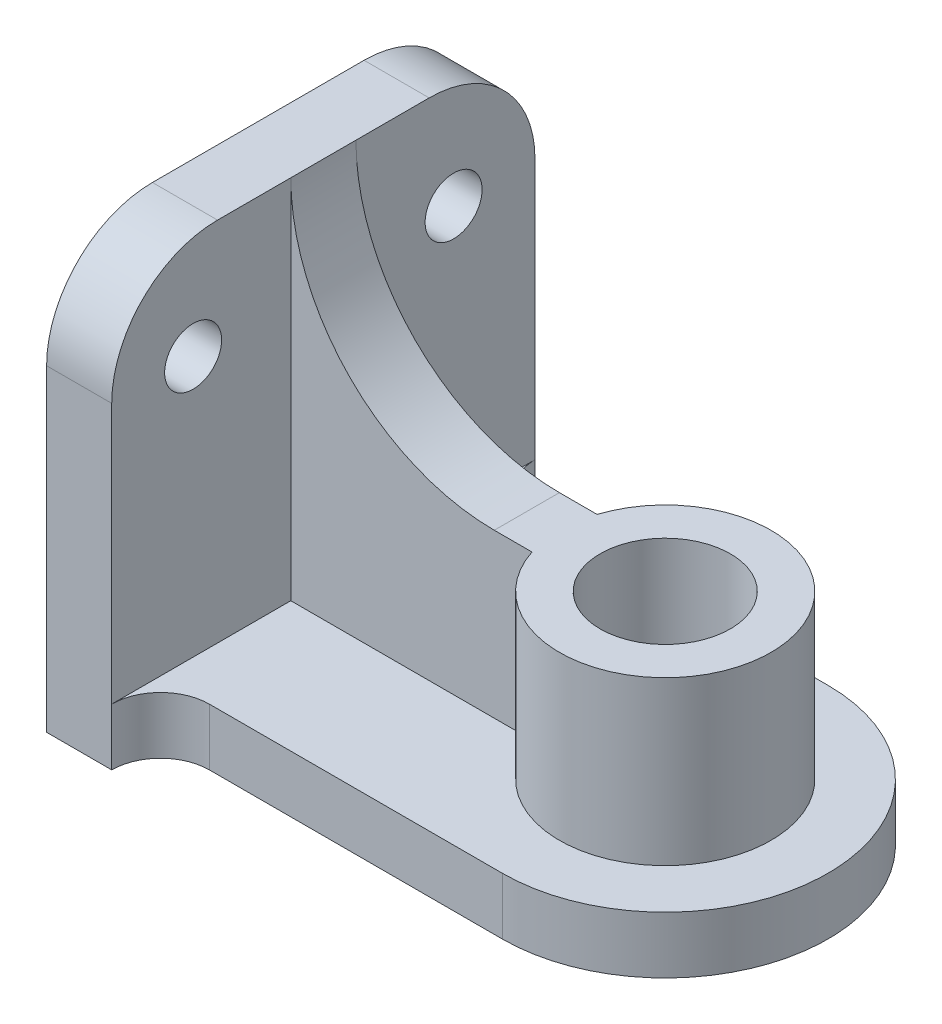
ISO-10303-21;
HEADER;
FILE_DESCRIPTION(('STEP AP214'),'2;1');
FILE_NAME('part.step','',(''),(''),'','','');
FILE_SCHEMA(('AUTOMOTIVE_DESIGN { 1 0 10303 214 1 1 1 1 }'));
ENDSEC;
DATA;
#1=APPLICATION_CONTEXT('core data for automotive mechanical design processes');
#2=APPLICATION_PROTOCOL_DEFINITION('international standard','automotive_design',2000,#1);
#3=PRODUCT_CONTEXT('',#1,'mechanical');
#4=PRODUCT('Part','Part','',(#3));
#5=PRODUCT_RELATED_PRODUCT_CATEGORY('part','',(#4));
#6=PRODUCT_DEFINITION_FORMATION('','',#4);
#7=PRODUCT_DEFINITION_CONTEXT('part definition',#1,'design');
#8=PRODUCT_DEFINITION('design','',#6,#7);
#9=PRODUCT_DEFINITION_SHAPE('','',#8);
#10=(LENGTH_UNIT() NAMED_UNIT(*) SI_UNIT(.MILLI.,.METRE.));
#11=(NAMED_UNIT(*) PLANE_ANGLE_UNIT() SI_UNIT($,.RADIAN.));
#12=(NAMED_UNIT(*) SI_UNIT($,.STERADIAN.) SOLID_ANGLE_UNIT());
#13=UNCERTAINTY_MEASURE_WITH_UNIT(LENGTH_MEASURE(1.E-05),#10,'distance_accuracy_value','');
#14=(GEOMETRIC_REPRESENTATION_CONTEXT(3) GLOBAL_UNCERTAINTY_ASSIGNED_CONTEXT((#13)) GLOBAL_UNIT_ASSIGNED_CONTEXT((#10,
#11,#12)) REPRESENTATION_CONTEXT('',''));
#15=CARTESIAN_POINT('',(0.,0.,0.));
#16=DIRECTION('',(0.,0.,1.));
#17=DIRECTION('',(1.,0.,0.));
#18=AXIS2_PLACEMENT_3D('',#15,#16,#17);
#19=CARTESIAN_POINT('',(4.,52.,0.));
#20=DIRECTION('',(-1.,0.,0.));
#21=DIRECTION('',(0.,0.,1.));
#22=AXIS2_PLACEMENT_3D('',#19,#20,#21);
#23=PLANE('',#22);
#24=CARTESIAN_POINT('',(4.,39.,-16.));
#25=DIRECTION('',(1.,0.,0.));
#26=DIRECTION('',(0.,0.,-1.));
#27=AXIS2_PLACEMENT_3D('',#24,#25,#26);
#28=CIRCLE('',#27,3.5);
#29=CARTESIAN_POINT('',(4.,39.,-19.5));
#30=VERTEX_POINT('',#29);
#31=EDGE_CURVE('E348',#30,#30,#28,.T.);
#32=ORIENTED_EDGE('',*,*,#31,.F.);
#33=EDGE_LOOP('',(#32));
#34=FACE_BOUND('',#33,.T.);
#35=DIRECTION('',(0.,0.,-1.));
#36=VECTOR('',#35,1.);
#37=CARTESIAN_POINT('',(4.,52.,0.));
#38=LINE('',#37,#36);
#39=CARTESIAN_POINT('',(4.,52.,-4.));
#40=VERTEX_POINT('',#39);
#41=CARTESIAN_POINT('',(4.,52.,-13.));
#42=VERTEX_POINT('',#41);
#43=EDGE_CURVE('E227',#40,#42,#38,.T.);
#44=ORIENTED_EDGE('',*,*,#43,.F.);
#45=DIRECTION('',(0.,-1.,0.));
#46=VECTOR('',#45,1.);
#47=CARTESIAN_POINT('',(4.,27.,-4.));
#48=LINE('',#47,#46);
#49=CARTESIAN_POINT('',(4.,7.,-4.));
#50=VERTEX_POINT('',#49);
#51=EDGE_CURVE('E220',#40,#50,#48,.T.);
#52=ORIENTED_EDGE('',*,*,#51,.T.);
#53=DIRECTION('',(0.,0.,-1.));
#54=VECTOR('',#53,1.);
#55=CARTESIAN_POINT('',(4.,7.,0.));
#56=LINE('',#55,#54);
#57=CARTESIAN_POINT('',(4.,7.,-26.));
#58=VERTEX_POINT('',#57);
#59=EDGE_CURVE('E186',#50,#58,#56,.T.);
#60=ORIENTED_EDGE('',*,*,#59,.T.);
#61=DIRECTION('',(0.,-1.,0.));
#62=VECTOR('',#61,1.);
#63=CARTESIAN_POINT('',(4.,52.,-26.));
#64=LINE('',#63,#62);
#65=CARTESIAN_POINT('',(4.,39.,-26.));
#66=VERTEX_POINT('',#65);
#67=EDGE_CURVE('E248',#66,#58,#64,.T.);
#68=ORIENTED_EDGE('',*,*,#67,.F.);
#69=CARTESIAN_POINT('',(4.,39.,-13.));
#70=DIRECTION('',(-1.,0.,0.));
#71=DIRECTION('',(0.,0.,1.));
#72=AXIS2_PLACEMENT_3D('',#69,#70,#71);
#73=CIRCLE('',#72,13.);
#74=EDGE_CURVE('E255',#66,#42,#73,.F.);
#75=ORIENTED_EDGE('',*,*,#74,.T.);
#76=EDGE_LOOP('',(#44,#52,#60,#68,#75));
#77=FACE_BOUND('',#76,.T.);
#78=ADVANCED_FACE('F41',(#34,#77),#23,.F.);
#79=CARTESIAN_POINT('',(4.,39.,16.));
#80=DIRECTION('',(1.,0.,0.));
#81=DIRECTION('',(0.,0.,-1.));
#82=AXIS2_PLACEMENT_3D('',#79,#80,#81);
#83=CIRCLE('',#82,3.5);
#84=CARTESIAN_POINT('',(4.,39.,12.5));
#85=VERTEX_POINT('',#84);
#86=EDGE_CURVE('E354',#85,#85,#83,.T.);
#87=ORIENTED_EDGE('',*,*,#86,.F.);
#88=EDGE_LOOP('',(#87));
#89=FACE_BOUND('',#88,.T.);
#90=DIRECTION('',(0.,-1.,0.));
#91=VECTOR('',#90,1.);
#92=CARTESIAN_POINT('',(4.,27.,4.));
#93=LINE('',#92,#91);
#94=CARTESIAN_POINT('',(4.,52.,4.));
#95=VERTEX_POINT('',#94);
#96=CARTESIAN_POINT('',(4.,7.,4.));
#97=VERTEX_POINT('',#96);
#98=EDGE_CURVE('E217',#95,#97,#93,.T.);
#99=ORIENTED_EDGE('',*,*,#98,.F.);
#100=CARTESIAN_POINT('',(4.,52.,13.));
#101=VERTEX_POINT('',#100);
#102=EDGE_CURVE('E231',#101,#95,#38,.T.);
#103=ORIENTED_EDGE('',*,*,#102,.F.);
#104=CARTESIAN_POINT('',(4.,39.,13.));
#105=DIRECTION('',(-1.,0.,0.));
#106=DIRECTION('',(0.,0.,1.));
#107=AXIS2_PLACEMENT_3D('',#104,#105,#106);
#108=CIRCLE('',#107,13.);
#109=CARTESIAN_POINT('',(4.,39.,26.));
#110=VERTEX_POINT('',#109);
#111=EDGE_CURVE('E253',#101,#110,#108,.F.);
#112=ORIENTED_EDGE('',*,*,#111,.T.);
#113=DIRECTION('',(0.,-1.,0.));
#114=VECTOR('',#113,1.);
#115=CARTESIAN_POINT('',(4.,52.,26.));
#116=LINE('',#115,#114);
#117=CARTESIAN_POINT('',(4.,7.,26.));
#118=VERTEX_POINT('',#117);
#119=EDGE_CURVE('E252',#110,#118,#116,.T.);
#120=ORIENTED_EDGE('',*,*,#119,.T.);
#121=EDGE_CURVE('E182',#118,#97,#56,.T.);
#122=ORIENTED_EDGE('',*,*,#121,.T.);
#123=EDGE_LOOP('',(#99,#103,#112,#120,#122));
#124=FACE_BOUND('',#123,.T.);
#125=ADVANCED_FACE('F307',(#89,#124),#23,.F.);
#126=CARTESIAN_POINT('',(0.,52.,26.));
#127=DIRECTION('',(0.,0.,-1.));
#128=DIRECTION('',(-1.,0.,0.));
#129=AXIS2_PLACEMENT_3D('',#126,#127,#128);
#130=PLANE('',#129);
#131=ORIENTED_EDGE('',*,*,#119,.F.);
#132=DIRECTION('',(1.,0.,0.));
#133=VECTOR('',#132,1.);
#134=CARTESIAN_POINT('',(-4.,39.,26.));
#135=LINE('',#134,#133);
#136=CARTESIAN_POINT('',(-4.,39.,26.));
#137=VERTEX_POINT('',#136);
#138=EDGE_CURVE('E56',#110,#137,#135,.F.);
#139=ORIENTED_EDGE('',*,*,#138,.T.);
#140=DIRECTION('',(0.,-1.,0.));
#141=VECTOR('',#140,1.);
#142=CARTESIAN_POINT('',(-4.,52.,26.));
#143=LINE('',#142,#141);
#144=CARTESIAN_POINT('',(-4.,0.,26.));
#145=VERTEX_POINT('',#144);
#146=EDGE_CURVE('E234',#137,#145,#143,.T.);
#147=ORIENTED_EDGE('',*,*,#146,.T.);
#148=DIRECTION('',(1.,0.,0.));
#149=VECTOR('',#148,1.);
#150=CARTESIAN_POINT('',(0.,0.,26.));
#151=LINE('',#150,#149);
#152=CARTESIAN_POINT('',(4.,0.,26.));
#153=VERTEX_POINT('',#152);
#154=EDGE_CURVE('E226',#145,#153,#151,.T.);
#155=ORIENTED_EDGE('',*,*,#154,.T.);
#156=EDGE_CURVE('E249',#118,#153,#116,.T.);
#157=ORIENTED_EDGE('',*,*,#156,.F.);
#158=EDGE_LOOP('',(#131,#139,#147,#155,#157));
#159=FACE_BOUND('',#158,.T.);
#160=ADVANCED_FACE('F291',(#159),#130,.F.);
#161=CARTESIAN_POINT('',(0.,52.,-26.));
#162=DIRECTION('',(0.,0.,-1.));
#163=DIRECTION('',(-1.,0.,0.));
#164=AXIS2_PLACEMENT_3D('',#161,#162,#163);
#165=PLANE('',#164);
#166=DIRECTION('',(0.,-1.,0.));
#167=VECTOR('',#166,1.);
#168=CARTESIAN_POINT('',(-4.,52.,-26.));
#169=LINE('',#168,#167);
#170=CARTESIAN_POINT('',(-4.,39.,-26.));
#171=VERTEX_POINT('',#170);
#172=CARTESIAN_POINT('',(-4.,0.,-26.));
#173=VERTEX_POINT('',#172);
#174=EDGE_CURVE('E243',#171,#173,#169,.T.);
#175=ORIENTED_EDGE('',*,*,#174,.F.);
#176=DIRECTION('',(1.,0.,0.));
#177=VECTOR('',#176,1.);
#178=CARTESIAN_POINT('',(0.,39.,-26.));
#179=LINE('',#178,#177);
#180=EDGE_CURVE('E263',#171,#66,#179,.T.);
#181=ORIENTED_EDGE('',*,*,#180,.T.);
#182=ORIENTED_EDGE('',*,*,#67,.T.);
#183=CARTESIAN_POINT('',(4.,0.,-26.));
#184=VERTEX_POINT('',#183);
#185=EDGE_CURVE('E245',#58,#184,#64,.T.);
#186=ORIENTED_EDGE('',*,*,#185,.T.);
#187=DIRECTION('',(1.,0.,0.));
#188=VECTOR('',#187,1.);
#189=CARTESIAN_POINT('',(0.,0.,-26.));
#190=LINE('',#189,#188);
#191=EDGE_CURVE('E237',#173,#184,#190,.T.);
#192=ORIENTED_EDGE('',*,*,#191,.F.);
#193=EDGE_LOOP('',(#175,#181,#182,#186,#192));
#194=FACE_BOUND('',#193,.T.);
#195=ADVANCED_FACE('F318',(#194),#165,.T.);
#196=CARTESIAN_POINT('',(-4.,52.,0.));
#197=DIRECTION('',(-1.,0.,0.));
#198=DIRECTION('',(0.,0.,1.));
#199=AXIS2_PLACEMENT_3D('',#196,#197,#198);
#200=PLANE('',#199);
#201=CARTESIAN_POINT('',(-4.,39.,16.));
#202=DIRECTION('',(1.,0.,0.));
#203=DIRECTION('',(0.,0.,-1.));
#204=AXIS2_PLACEMENT_3D('',#201,#202,#203);
#205=CIRCLE('',#204,3.5);
#206=CARTESIAN_POINT('',(-4.,39.,12.5));
#207=VERTEX_POINT('',#206);
#208=EDGE_CURVE('E351',#207,#207,#205,.T.);
#209=ORIENTED_EDGE('',*,*,#208,.T.);
#210=EDGE_LOOP('',(#209));
#211=FACE_BOUND('',#210,.T.);
#212=CARTESIAN_POINT('',(-4.,39.,-16.));
#213=DIRECTION('',(1.,0.,0.));
#214=DIRECTION('',(0.,0.,-1.));
#215=AXIS2_PLACEMENT_3D('',#212,#213,#214);
#216=CIRCLE('',#215,3.5);
#217=CARTESIAN_POINT('',(-4.,39.,-19.5));
#218=VERTEX_POINT('',#217);
#219=EDGE_CURVE('E195',#218,#218,#216,.T.);
#220=ORIENTED_EDGE('',*,*,#219,.T.);
#221=EDGE_LOOP('',(#220));
#222=FACE_BOUND('',#221,.T.);
#223=DIRECTION('',(0.,0.,-1.));
#224=VECTOR('',#223,1.);
#225=CARTESIAN_POINT('',(-4.,52.,0.));
#226=LINE('',#225,#224);
#227=CARTESIAN_POINT('',(-4.,52.,13.));
#228=VERTEX_POINT('',#227);
#229=CARTESIAN_POINT('',(-4.,52.,-13.));
#230=VERTEX_POINT('',#229);
#231=EDGE_CURVE('E232',#228,#230,#226,.T.);
#232=ORIENTED_EDGE('',*,*,#231,.T.);
#233=CARTESIAN_POINT('',(-4.,39.,-13.));
#234=DIRECTION('',(-1.,0.,0.));
#235=DIRECTION('',(0.,0.,1.));
#236=AXIS2_PLACEMENT_3D('',#233,#234,#235);
#237=CIRCLE('',#236,13.);
#238=EDGE_CURVE('E272',#230,#171,#237,.T.);
#239=ORIENTED_EDGE('',*,*,#238,.T.);
#240=ORIENTED_EDGE('',*,*,#174,.T.);
#241=DIRECTION('',(0.,0.,-1.));
#242=VECTOR('',#241,1.);
#243=CARTESIAN_POINT('',(-4.,0.,0.));
#244=LINE('',#243,#242);
#245=EDGE_CURVE('E230',#145,#173,#244,.T.);
#246=ORIENTED_EDGE('',*,*,#245,.F.);
#247=ORIENTED_EDGE('',*,*,#146,.F.);
#248=CARTESIAN_POINT('',(-4.,39.,13.));
#249=DIRECTION('',(-1.,0.,0.));
#250=DIRECTION('',(0.,0.,1.));
#251=AXIS2_PLACEMENT_3D('',#248,#249,#250);
#252=CIRCLE('',#251,13.);
#253=EDGE_CURVE('E270',#137,#228,#252,.T.);
#254=ORIENTED_EDGE('',*,*,#253,.T.);
#255=EDGE_LOOP('',(#232,#239,#240,#246,#247,#254));
#256=FACE_BOUND('',#255,.T.);
#257=ADVANCED_FACE('F397',(#211,#222,#256),#200,.T.);
#258=CARTESIAN_POINT('',(0.,52.,0.));
#259=DIRECTION('',(0.,1.,0.));
#260=DIRECTION('',(0.,0.,1.));
#261=AXIS2_PLACEMENT_3D('',#258,#259,#260);
#262=PLANE('',#261);
#263=ORIENTED_EDGE('',*,*,#43,.T.);
#264=DIRECTION('',(1.,0.,0.));
#265=VECTOR('',#264,1.);
#266=CARTESIAN_POINT('',(0.,52.,-13.));
#267=LINE('',#266,#265);
#268=EDGE_CURVE('E64',#42,#230,#267,.F.);
#269=ORIENTED_EDGE('',*,*,#268,.T.);
#270=ORIENTED_EDGE('',*,*,#231,.F.);
#271=DIRECTION('',(1.,0.,0.));
#272=VECTOR('',#271,1.);
#273=CARTESIAN_POINT('',(4.,52.,13.));
#274=LINE('',#273,#272);
#275=EDGE_CURVE('E266',#228,#101,#274,.T.);
#276=ORIENTED_EDGE('',*,*,#275,.T.);
#277=ORIENTED_EDGE('',*,*,#102,.T.);
#278=EDGE_CURVE('E229',#95,#40,#38,.T.);
#279=ORIENTED_EDGE('',*,*,#278,.T.);
#280=EDGE_LOOP('',(#263,#269,#270,#276,#277,#279));
#281=FACE_BOUND('',#280,.T.);
#282=ADVANCED_FACE('F341',(#281),#262,.T.);
#283=CARTESIAN_POINT('',(0.,0.,0.));
#284=DIRECTION('',(0.,1.,0.));
#285=DIRECTION('',(0.,0.,1.));
#286=AXIS2_PLACEMENT_3D('',#283,#284,#285);
#287=PLANE('',#286);
#288=ORIENTED_EDGE('',*,*,#191,.T.);
#289=CARTESIAN_POINT('',(10.,0.,-26.));
#290=DIRECTION('',(0.,1.,0.));
#291=DIRECTION('',(0.,0.,1.));
#292=AXIS2_PLACEMENT_3D('',#289,#290,#291);
#293=CIRCLE('',#292,6.);
#294=CARTESIAN_POINT('',(10.,0.,-20.));
#295=VERTEX_POINT('',#294);
#296=EDGE_CURVE('E280',#184,#295,#293,.T.);
#297=ORIENTED_EDGE('',*,*,#296,.T.);
#298=DIRECTION('',(-1.,0.,0.));
#299=VECTOR('',#298,1.);
#300=CARTESIAN_POINT('',(0.,0.,-20.));
#301=LINE('',#300,#299);
#302=CARTESIAN_POINT('',(46.,0.,-20.));
#303=VERTEX_POINT('',#302);
#304=EDGE_CURVE('E197',#303,#295,#301,.T.);
#305=ORIENTED_EDGE('',*,*,#304,.F.);
#306=CARTESIAN_POINT('',(46.,0.,0.));
#307=DIRECTION('',(0.,1.,0.));
#308=DIRECTION('',(0.,0.,1.));
#309=AXIS2_PLACEMENT_3D('',#306,#307,#308);
#310=CIRCLE('',#309,20.);
#311=CARTESIAN_POINT('',(46.,0.,20.));
#312=VERTEX_POINT('',#311);
#313=EDGE_CURVE('E194',#312,#303,#310,.T.);
#314=ORIENTED_EDGE('',*,*,#313,.F.);
#315=DIRECTION('',(-1.,0.,0.));
#316=VECTOR('',#315,1.);
#317=CARTESIAN_POINT('',(0.,0.,20.));
#318=LINE('',#317,#316);
#319=CARTESIAN_POINT('',(10.,0.,20.));
#320=VERTEX_POINT('',#319);
#321=EDGE_CURVE('E164',#312,#320,#318,.T.);
#322=ORIENTED_EDGE('',*,*,#321,.T.);
#323=CARTESIAN_POINT('',(10.,0.,26.));
#324=DIRECTION('',(0.,1.,0.));
#325=DIRECTION('',(0.,0.,1.));
#326=AXIS2_PLACEMENT_3D('',#323,#324,#325);
#327=CIRCLE('',#326,6.);
#328=EDGE_CURVE('E49',#320,#153,#327,.T.);
#329=ORIENTED_EDGE('',*,*,#328,.T.);
#330=ORIENTED_EDGE('',*,*,#154,.F.);
#331=ORIENTED_EDGE('',*,*,#245,.T.);
#332=EDGE_LOOP('',(#288,#297,#305,#314,#322,#329,#330,#331));
#333=FACE_BOUND('',#332,.T.);
#334=CARTESIAN_POINT('',(46.,0.,0.));
#335=DIRECTION('',(0.,1.,0.));
#336=DIRECTION('',(0.,0.,1.));
#337=AXIS2_PLACEMENT_3D('',#334,#335,#336);
#338=CIRCLE('',#337,8.);
#339=CARTESIAN_POINT('',(46.,0.,8.));
#340=VERTEX_POINT('',#339);
#341=EDGE_CURVE('E167',#340,#340,#338,.T.);
#342=ORIENTED_EDGE('',*,*,#341,.T.);
#343=EDGE_LOOP('',(#342));
#344=FACE_BOUND('',#343,.T.);
#345=ADVANCED_FACE('F286',(#333,#344),#287,.F.);
#346=CARTESIAN_POINT('',(46.,27.,0.));
#347=DIRECTION('',(0.,-1.,0.));
#348=DIRECTION('',(0.,0.,-1.));
#349=AXIS2_PLACEMENT_3D('',#346,#347,#348);
#350=CYLINDRICAL_SURFACE('',#349,13.);
#351=DIRECTION('',(0.,-1.,0.));
#352=VECTOR('',#351,1.);
#353=CARTESIAN_POINT('',(33.630683123147,27.,4.));
#354=LINE('',#353,#352);
#355=CARTESIAN_POINT('',(33.630683123147,27.,4.));
#356=VERTEX_POINT('',#355);
#357=CARTESIAN_POINT('',(33.630683123147,7.,4.));
#358=VERTEX_POINT('',#357);
#359=EDGE_CURVE('E212',#356,#358,#354,.T.);
#360=ORIENTED_EDGE('',*,*,#359,.T.);
#361=CARTESIAN_POINT('',(46.,7.,0.));
#362=DIRECTION('',(0.,1.,0.));
#363=DIRECTION('',(0.,0.,1.));
#364=AXIS2_PLACEMENT_3D('',#361,#362,#363);
#365=CIRCLE('',#364,13.);
#366=CARTESIAN_POINT('',(33.630683123147,7.,-4.));
#367=VERTEX_POINT('',#366);
#368=EDGE_CURVE('E200',#358,#367,#365,.T.);
#369=ORIENTED_EDGE('',*,*,#368,.T.);
#370=DIRECTION('',(0.,-1.,0.));
#371=VECTOR('',#370,1.);
#372=CARTESIAN_POINT('',(33.630683123147,27.,-4.));
#373=LINE('',#372,#371);
#374=CARTESIAN_POINT('',(33.630683123147,27.,-4.));
#375=VERTEX_POINT('',#374);
#376=EDGE_CURVE('E223',#375,#367,#373,.T.);
#377=ORIENTED_EDGE('',*,*,#376,.F.);
#378=CARTESIAN_POINT('',(46.,27.,0.));
#379=DIRECTION('',(0.,1.,0.));
#380=DIRECTION('',(0.,0.,1.));
#381=AXIS2_PLACEMENT_3D('',#378,#379,#380);
#382=CIRCLE('',#381,13.);
#383=EDGE_CURVE('E205',#356,#375,#382,.T.);
#384=ORIENTED_EDGE('',*,*,#383,.F.);
#385=EDGE_LOOP('',(#360,#369,#377,#384));
#386=FACE_BOUND('',#385,.T.);
#387=ADVANCED_FACE('F387',(#386),#350,.T.);
#388=CARTESIAN_POINT('',(0.,27.,-4.));
#389=DIRECTION('',(0.,0.,-1.));
#390=DIRECTION('',(-1.,0.,0.));
#391=AXIS2_PLACEMENT_3D('',#388,#389,#390);
#392=PLANE('',#391);
#393=DIRECTION('',(1.,0.,0.));
#394=VECTOR('',#393,1.);
#395=CARTESIAN_POINT('',(0.,7.,-4.));
#396=LINE('',#395,#394);
#397=EDGE_CURVE('E190',#50,#367,#396,.T.);
#398=ORIENTED_EDGE('',*,*,#397,.F.);
#399=ORIENTED_EDGE('',*,*,#51,.F.);
#400=CARTESIAN_POINT('',(29.,52.,-4.));
#401=DIRECTION('',(0.,0.,-1.));
#402=DIRECTION('',(-1.,0.,0.));
#403=AXIS2_PLACEMENT_3D('',#400,#401,#402);
#404=CIRCLE('',#403,25.);
#405=CARTESIAN_POINT('',(29.,27.,-4.));
#406=VERTEX_POINT('',#405);
#407=EDGE_CURVE('E275',#40,#406,#404,.F.);
#408=ORIENTED_EDGE('',*,*,#407,.T.);
#409=DIRECTION('',(1.,0.,0.));
#410=VECTOR('',#409,1.);
#411=CARTESIAN_POINT('',(0.,27.,-4.));
#412=LINE('',#411,#410);
#413=EDGE_CURVE('E208',#406,#375,#412,.T.);
#414=ORIENTED_EDGE('',*,*,#413,.T.);
#415=ORIENTED_EDGE('',*,*,#376,.T.);
#416=EDGE_LOOP('',(#398,#399,#408,#414,#415));
#417=FACE_BOUND('',#416,.T.);
#418=ADVANCED_FACE('F384',(#417),#392,.T.);
#419=CARTESIAN_POINT('',(46.,27.,0.));
#420=DIRECTION('',(0.,-1.,0.));
#421=DIRECTION('',(0.,0.,-1.));
#422=AXIS2_PLACEMENT_3D('',#419,#420,#421);
#423=CYLINDRICAL_SURFACE('',#422,8.);
#424=CARTESIAN_POINT('',(46.,27.,0.));
#425=DIRECTION('',(0.,1.,0.));
#426=DIRECTION('',(0.,0.,1.));
#427=AXIS2_PLACEMENT_3D('',#424,#425,#426);
#428=CIRCLE('',#427,8.);
#429=CARTESIAN_POINT('',(46.,27.,8.));
#430=VERTEX_POINT('',#429);
#431=EDGE_CURVE('E202',#430,#430,#428,.T.);
#432=ORIENTED_EDGE('',*,*,#431,.T.);
#433=EDGE_LOOP('',(#432));
#434=FACE_BOUND('',#433,.T.);
#435=ORIENTED_EDGE('',*,*,#341,.F.);
#436=EDGE_LOOP('',(#435));
#437=FACE_BOUND('',#436,.T.);
#438=ADVANCED_FACE('F383',(#434,#437),#423,.F.);
#439=CARTESIAN_POINT('',(0.,27.,4.));
#440=DIRECTION('',(0.,0.,-1.));
#441=DIRECTION('',(-1.,0.,0.));
#442=AXIS2_PLACEMENT_3D('',#439,#440,#441);
#443=PLANE('',#442);
#444=ORIENTED_EDGE('',*,*,#98,.T.);
#445=DIRECTION('',(1.,0.,0.));
#446=VECTOR('',#445,1.);
#447=CARTESIAN_POINT('',(0.,7.,4.));
#448=LINE('',#447,#446);
#449=EDGE_CURVE('E184',#97,#358,#448,.T.);
#450=ORIENTED_EDGE('',*,*,#449,.T.);
#451=ORIENTED_EDGE('',*,*,#359,.F.);
#452=DIRECTION('',(1.,0.,0.));
#453=VECTOR('',#452,1.);
#454=CARTESIAN_POINT('',(0.,27.,4.));
#455=LINE('',#454,#453);
#456=CARTESIAN_POINT('',(29.,27.,4.));
#457=VERTEX_POINT('',#456);
#458=EDGE_CURVE('E210',#457,#356,#455,.T.);
#459=ORIENTED_EDGE('',*,*,#458,.F.);
#460=CARTESIAN_POINT('',(29.,52.,4.));
#461=DIRECTION('',(0.,0.,-1.));
#462=DIRECTION('',(-1.,0.,0.));
#463=AXIS2_PLACEMENT_3D('',#460,#461,#462);
#464=CIRCLE('',#463,25.);
#465=EDGE_CURVE('E277',#457,#95,#464,.T.);
#466=ORIENTED_EDGE('',*,*,#465,.T.);
#467=EDGE_LOOP('',(#444,#450,#451,#459,#466));
#468=FACE_BOUND('',#467,.T.);
#469=ADVANCED_FACE('F337',(#468),#443,.F.);
#470=CARTESIAN_POINT('',(0.,27.,0.));
#471=DIRECTION('',(0.,1.,0.));
#472=DIRECTION('',(0.,0.,1.));
#473=AXIS2_PLACEMENT_3D('',#470,#471,#472);
#474=PLANE('',#473);
#475=ORIENTED_EDGE('',*,*,#431,.F.);
#476=EDGE_LOOP('',(#475));
#477=FACE_BOUND('',#476,.T.);
#478=ORIENTED_EDGE('',*,*,#413,.F.);
#479=DIRECTION('',(0.,0.,-1.));
#480=VECTOR('',#479,1.);
#481=CARTESIAN_POINT('',(29.,27.,0.));
#482=LINE('',#481,#480);
#483=EDGE_CURVE('E257',#406,#457,#482,.F.);
#484=ORIENTED_EDGE('',*,*,#483,.T.);
#485=ORIENTED_EDGE('',*,*,#458,.T.);
#486=ORIENTED_EDGE('',*,*,#383,.T.);
#487=EDGE_LOOP('',(#478,#484,#485,#486));
#488=FACE_BOUND('',#487,.T.);
#489=ADVANCED_FACE('F377',(#477,#488),#474,.T.);
#490=CARTESIAN_POINT('',(0.,7.,20.));
#491=DIRECTION('',(0.,0.,1.));
#492=DIRECTION('',(1.,0.,0.));
#493=AXIS2_PLACEMENT_3D('',#490,#491,#492);
#494=PLANE('',#493);
#495=DIRECTION('',(-1.,0.,0.));
#496=VECTOR('',#495,1.);
#497=CARTESIAN_POINT('',(0.,7.,20.));
#498=LINE('',#497,#496);
#499=CARTESIAN_POINT('',(46.,7.,20.));
#500=VERTEX_POINT('',#499);
#501=CARTESIAN_POINT('',(10.,7.,20.));
#502=VERTEX_POINT('',#501);
#503=EDGE_CURVE('E161',#500,#502,#498,.T.);
#504=ORIENTED_EDGE('',*,*,#503,.T.);
#505=DIRECTION('',(0.,-1.,0.));
#506=VECTOR('',#505,1.);
#507=CARTESIAN_POINT('',(10.,7.,20.));
#508=LINE('',#507,#506);
#509=EDGE_CURVE('E261',#502,#320,#508,.T.);
#510=ORIENTED_EDGE('',*,*,#509,.T.);
#511=ORIENTED_EDGE('',*,*,#321,.F.);
#512=DIRECTION('',(0.,-1.,0.));
#513=VECTOR('',#512,1.);
#514=CARTESIAN_POINT('',(46.,7.,20.));
#515=LINE('',#514,#513);
#516=EDGE_CURVE('E156',#500,#312,#515,.T.);
#517=ORIENTED_EDGE('',*,*,#516,.F.);
#518=EDGE_LOOP('',(#504,#510,#511,#517));
#519=FACE_BOUND('',#518,.T.);
#520=ADVANCED_FACE('F158',(#519),#494,.T.);
#521=CARTESIAN_POINT('',(46.,7.,0.));
#522=DIRECTION('',(0.,-1.,0.));
#523=DIRECTION('',(0.,0.,-1.));
#524=AXIS2_PLACEMENT_3D('',#521,#522,#523);
#525=CYLINDRICAL_SURFACE('',#524,20.);
#526=ORIENTED_EDGE('',*,*,#313,.T.);
#527=DIRECTION('',(0.,-1.,0.));
#528=VECTOR('',#527,1.);
#529=CARTESIAN_POINT('',(46.,7.,-20.));
#530=LINE('',#529,#528);
#531=CARTESIAN_POINT('',(46.,7.,-20.));
#532=VERTEX_POINT('',#531);
#533=EDGE_CURVE('E168',#532,#303,#530,.T.);
#534=ORIENTED_EDGE('',*,*,#533,.F.);
#535=CARTESIAN_POINT('',(46.,7.,0.));
#536=DIRECTION('',(0.,1.,0.));
#537=DIRECTION('',(0.,0.,1.));
#538=AXIS2_PLACEMENT_3D('',#535,#536,#537);
#539=CIRCLE('',#538,20.);
#540=EDGE_CURVE('E171',#500,#532,#539,.T.);
#541=ORIENTED_EDGE('',*,*,#540,.F.);
#542=ORIENTED_EDGE('',*,*,#516,.T.);
#543=EDGE_LOOP('',(#526,#534,#541,#542));
#544=FACE_BOUND('',#543,.T.);
#545=ADVANCED_FACE('F172',(#544),#525,.T.);
#546=CARTESIAN_POINT('',(0.,7.,-20.));
#547=DIRECTION('',(0.,0.,1.));
#548=DIRECTION('',(1.,0.,0.));
#549=AXIS2_PLACEMENT_3D('',#546,#547,#548);
#550=PLANE('',#549);
#551=ORIENTED_EDGE('',*,*,#304,.T.);
#552=DIRECTION('',(0.,-1.,0.));
#553=VECTOR('',#552,1.);
#554=CARTESIAN_POINT('',(10.,7.,-20.));
#555=LINE('',#554,#553);
#556=CARTESIAN_POINT('',(10.,7.,-20.));
#557=VERTEX_POINT('',#556);
#558=EDGE_CURVE('E259',#295,#557,#555,.F.);
#559=ORIENTED_EDGE('',*,*,#558,.T.);
#560=DIRECTION('',(-1.,0.,0.));
#561=VECTOR('',#560,1.);
#562=CARTESIAN_POINT('',(0.,7.,-20.));
#563=LINE('',#562,#561);
#564=EDGE_CURVE('E177',#532,#557,#563,.T.);
#565=ORIENTED_EDGE('',*,*,#564,.F.);
#566=ORIENTED_EDGE('',*,*,#533,.T.);
#567=EDGE_LOOP('',(#551,#559,#565,#566));
#568=FACE_BOUND('',#567,.T.);
#569=ADVANCED_FACE('F327',(#568),#550,.F.);
#570=CARTESIAN_POINT('',(0.,7.,0.));
#571=DIRECTION('',(0.,1.,0.));
#572=DIRECTION('',(0.,0.,1.));
#573=AXIS2_PLACEMENT_3D('',#570,#571,#572);
#574=PLANE('',#573);
#575=ORIENTED_EDGE('',*,*,#368,.F.);
#576=ORIENTED_EDGE('',*,*,#449,.F.);
#577=ORIENTED_EDGE('',*,*,#121,.F.);
#578=CARTESIAN_POINT('',(10.,7.,26.));
#579=DIRECTION('',(0.,1.,0.));
#580=DIRECTION('',(0.,0.,1.));
#581=AXIS2_PLACEMENT_3D('',#578,#579,#580);
#582=CIRCLE('',#581,6.);
#583=EDGE_CURVE('E12',#118,#502,#582,.F.);
#584=ORIENTED_EDGE('',*,*,#583,.T.);
#585=ORIENTED_EDGE('',*,*,#503,.F.);
#586=ORIENTED_EDGE('',*,*,#540,.T.);
#587=ORIENTED_EDGE('',*,*,#564,.T.);
#588=CARTESIAN_POINT('',(10.,7.,-26.));
#589=DIRECTION('',(0.,1.,0.));
#590=DIRECTION('',(0.,0.,1.));
#591=AXIS2_PLACEMENT_3D('',#588,#589,#590);
#592=CIRCLE('',#591,6.);
#593=EDGE_CURVE('E282',#557,#58,#592,.F.);
#594=ORIENTED_EDGE('',*,*,#593,.T.);
#595=ORIENTED_EDGE('',*,*,#59,.F.);
#596=ORIENTED_EDGE('',*,*,#397,.T.);
#597=EDGE_LOOP('',(#575,#576,#577,#584,#585,#586,#587,#594,#595,#596));
#598=FACE_BOUND('',#597,.T.);
#599=ADVANCED_FACE('F180',(#598),#574,.T.);
#600=CARTESIAN_POINT('',(29.,52.,0.));
#601=DIRECTION('',(0.,0.,-1.));
#602=DIRECTION('',(-1.,0.,0.));
#603=AXIS2_PLACEMENT_3D('',#600,#601,#602);
#604=CYLINDRICAL_SURFACE('',#603,25.);
#605=ORIENTED_EDGE('',*,*,#465,.F.);
#606=ORIENTED_EDGE('',*,*,#483,.F.);
#607=ORIENTED_EDGE('',*,*,#407,.F.);
#608=ORIENTED_EDGE('',*,*,#278,.F.);
#609=EDGE_LOOP('',(#605,#606,#607,#608));
#610=FACE_BOUND('',#609,.T.);
#611=ADVANCED_FACE('F303',(#610),#604,.F.);
#612=CARTESIAN_POINT('',(10.,52.,-26.));
#613=DIRECTION('',(0.,1.,0.));
#614=DIRECTION('',(0.,0.,1.));
#615=AXIS2_PLACEMENT_3D('',#612,#613,#614);
#616=CYLINDRICAL_SURFACE('',#615,6.);
#617=ORIENTED_EDGE('',*,*,#593,.F.);
#618=ORIENTED_EDGE('',*,*,#558,.F.);
#619=ORIENTED_EDGE('',*,*,#296,.F.);
#620=ORIENTED_EDGE('',*,*,#185,.F.);
#621=EDGE_LOOP('',(#617,#618,#619,#620));
#622=FACE_BOUND('',#621,.T.);
#623=ADVANCED_FACE('F296',(#622),#616,.F.);
#624=CARTESIAN_POINT('',(10.,7.,26.));
#625=DIRECTION('',(0.,-1.,0.));
#626=DIRECTION('',(0.,0.,-1.));
#627=AXIS2_PLACEMENT_3D('',#624,#625,#626);
#628=CYLINDRICAL_SURFACE('',#627,6.);
#629=ORIENTED_EDGE('',*,*,#583,.F.);
#630=ORIENTED_EDGE('',*,*,#156,.T.);
#631=ORIENTED_EDGE('',*,*,#328,.F.);
#632=ORIENTED_EDGE('',*,*,#509,.F.);
#633=EDGE_LOOP('',(#629,#630,#631,#632));
#634=FACE_BOUND('',#633,.T.);
#635=ADVANCED_FACE('F293',(#634),#628,.F.);
#636=CARTESIAN_POINT('',(0.,39.,-13.));
#637=DIRECTION('',(1.,0.,0.));
#638=DIRECTION('',(0.,0.,-1.));
#639=AXIS2_PLACEMENT_3D('',#636,#637,#638);
#640=CYLINDRICAL_SURFACE('',#639,13.);
#641=ORIENTED_EDGE('',*,*,#238,.F.);
#642=ORIENTED_EDGE('',*,*,#268,.F.);
#643=ORIENTED_EDGE('',*,*,#74,.F.);
#644=ORIENTED_EDGE('',*,*,#180,.F.);
#645=EDGE_LOOP('',(#641,#642,#643,#644));
#646=FACE_BOUND('',#645,.T.);
#647=ADVANCED_FACE('F295',(#646),#640,.T.);
#648=CARTESIAN_POINT('',(0.,39.,13.));
#649=DIRECTION('',(-1.,0.,0.));
#650=DIRECTION('',(0.,0.,1.));
#651=AXIS2_PLACEMENT_3D('',#648,#649,#650);
#652=CYLINDRICAL_SURFACE('',#651,13.);
#653=ORIENTED_EDGE('',*,*,#253,.F.);
#654=ORIENTED_EDGE('',*,*,#138,.F.);
#655=ORIENTED_EDGE('',*,*,#111,.F.);
#656=ORIENTED_EDGE('',*,*,#275,.F.);
#657=EDGE_LOOP('',(#653,#654,#655,#656));
#658=FACE_BOUND('',#657,.T.);
#659=ADVANCED_FACE('F43',(#658),#652,.T.);
#660=CARTESIAN_POINT('',(4.,39.,-16.));
#661=DIRECTION('',(1.,0.,0.));
#662=DIRECTION('',(0.,0.,-1.));
#663=AXIS2_PLACEMENT_3D('',#660,#661,#662);
#664=CYLINDRICAL_SURFACE('',#663,3.5);
#665=ORIENTED_EDGE('',*,*,#219,.F.);
#666=EDGE_LOOP('',(#665));
#667=FACE_BOUND('',#666,.T.);
#668=ORIENTED_EDGE('',*,*,#31,.T.);
#669=EDGE_LOOP('',(#668));
#670=FACE_BOUND('',#669,.T.);
#671=ADVANCED_FACE('F360',(#667,#670),#664,.F.);
#672=CARTESIAN_POINT('',(4.,39.,16.));
#673=DIRECTION('',(1.,0.,0.));
#674=DIRECTION('',(0.,0.,-1.));
#675=AXIS2_PLACEMENT_3D('',#672,#673,#674);
#676=CYLINDRICAL_SURFACE('',#675,3.5);
#677=ORIENTED_EDGE('',*,*,#208,.F.);
#678=EDGE_LOOP('',(#677));
#679=FACE_BOUND('',#678,.T.);
#680=ORIENTED_EDGE('',*,*,#86,.T.);
#681=EDGE_LOOP('',(#680));
#682=FACE_BOUND('',#681,.T.);
#683=ADVANCED_FACE('F358',(#679,#682),#676,.F.);
#684=CLOSED_SHELL('',(#78,#125,#160,#195,#257,#282,#345,#387,#418,#438,#469,#489,#520,#545,#569,
#599,#611,#623,#635,#647,#659,#671,#683));
#685=MANIFOLD_SOLID_BREP('B2',#684);
#686=ADVANCED_BREP_SHAPE_REPRESENTATION('',(#18,#685),#14);
#687=SHAPE_DEFINITION_REPRESENTATION(#9,#686);
ENDSEC;
END-ISO-10303-21;
